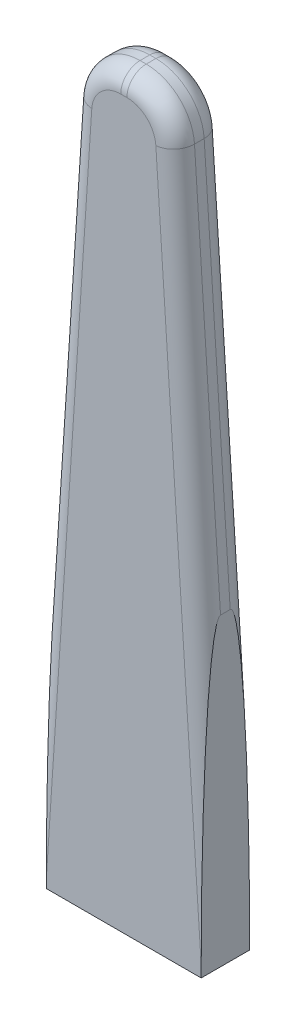
ISO-10303-21;
HEADER;
FILE_DESCRIPTION(('STEP AP214'),'2;1');
FILE_NAME('part.step','',(''),(''),'','','');
FILE_SCHEMA(('AUTOMOTIVE_DESIGN { 1 0 10303 214 1 1 1 1 }'));
ENDSEC;
DATA;
#1=APPLICATION_CONTEXT('core data for automotive mechanical design processes');
#2=APPLICATION_PROTOCOL_DEFINITION('international standard','automotive_design',2000,#1);
#3=PRODUCT_CONTEXT('',#1,'mechanical');
#4=PRODUCT('Part','Part','',(#3));
#5=PRODUCT_RELATED_PRODUCT_CATEGORY('part','',(#4));
#6=PRODUCT_DEFINITION_FORMATION('','',#4);
#7=PRODUCT_DEFINITION_CONTEXT('part definition',#1,'design');
#8=PRODUCT_DEFINITION('design','',#6,#7);
#9=PRODUCT_DEFINITION_SHAPE('','',#8);
#10=(LENGTH_UNIT() NAMED_UNIT(*) SI_UNIT(.MILLI.,.METRE.));
#11=(NAMED_UNIT(*) PLANE_ANGLE_UNIT() SI_UNIT($,.RADIAN.));
#12=(NAMED_UNIT(*) SI_UNIT($,.STERADIAN.) SOLID_ANGLE_UNIT());
#13=UNCERTAINTY_MEASURE_WITH_UNIT(LENGTH_MEASURE(1.E-05),#10,'distance_accuracy_value','');
#14=(GEOMETRIC_REPRESENTATION_CONTEXT(3) GLOBAL_UNCERTAINTY_ASSIGNED_CONTEXT((#13)) GLOBAL_UNIT_ASSIGNED_CONTEXT((#10,
#11,#12)) REPRESENTATION_CONTEXT('',''));
#15=CARTESIAN_POINT('',(0.,0.,0.));
#16=DIRECTION('',(0.,0.,1.));
#17=DIRECTION('',(1.,0.,0.));
#18=AXIS2_PLACEMENT_3D('',#15,#16,#17);
#19=CARTESIAN_POINT('',(0.,0.,0.));
#20=DIRECTION('',(0.,0.,-1.));
#21=DIRECTION('',(-1.,0.,0.));
#22=AXIS2_PLACEMENT_3D('',#19,#20,#21);
#23=PLANE('',#22);
#24=DIRECTION('',(0.,1.,0.));
#25=VECTOR('',#24,1.);
#26=CARTESIAN_POINT('',(1.3,0.,0.));
#27=LINE('',#26,#25);
#28=CARTESIAN_POINT('',(1.3,-3.0399195895799,0.));
#29=VERTEX_POINT('',#28);
#30=CARTESIAN_POINT('',(1.3,-3.15,0.));
#31=VERTEX_POINT('',#30);
#32=EDGE_CURVE('E102',#29,#31,#27,.F.);
#33=ORIENTED_EDGE('',*,*,#32,.T.);
#34=DIRECTION('',(-1.,0.,0.));
#35=VECTOR('',#34,1.);
#36=CARTESIAN_POINT('',(0.,-3.15,0.));
#37=LINE('',#36,#35);
#38=CARTESIAN_POINT('',(-0.3,-3.15,0.));
#39=VERTEX_POINT('',#38);
#40=EDGE_CURVE('E105',#31,#39,#37,.T.);
#41=ORIENTED_EDGE('',*,*,#40,.T.);
#42=DIRECTION('',(0.,1.,0.));
#43=VECTOR('',#42,1.);
#44=CARTESIAN_POINT('',(-0.3,0.,0.));
#45=LINE('',#44,#43);
#46=CARTESIAN_POINT('',(-0.300000000000003,-3.03991958957991,0.));
#47=VERTEX_POINT('',#46);
#48=EDGE_CURVE('E72',#39,#47,#45,.T.);
#49=ORIENTED_EDGE('',*,*,#48,.T.);
#50=DIRECTION('',(0.0657912139141957,0.99783341103197,0.));
#51=VECTOR('',#50,1.);
#52=CARTESIAN_POINT('',(0.199566682206393,4.53684175721716,0.));
#53=LINE('',#52,#51);
#54=CARTESIAN_POINT('',(0.168768590357411,4.06973736417426,0.));
#55=VERTEX_POINT('',#54);
#56=EDGE_CURVE('E109',#55,#47,#53,.F.);
#57=ORIENTED_EDGE('',*,*,#56,.F.);
#58=CARTESIAN_POINT('',(0.468118613667002,4.05,0.));
#59=DIRECTION('',(0.,0.,1.));
#60=DIRECTION('',(0.,1.,0.));
#61=AXIS2_PLACEMENT_3D('',#58,#59,#60);
#62=CIRCLE('',#61,0.3);
#63=CARTESIAN_POINT('',(0.468118613667002,4.35,0.));
#64=VERTEX_POINT('',#63);
#65=EDGE_CURVE('E166',#64,#55,#62,.T.);
#66=ORIENTED_EDGE('',*,*,#65,.F.);
#67=DIRECTION('',(-1.,0.,0.));
#68=VECTOR('',#67,1.);
#69=CARTESIAN_POINT('',(0.,4.35,0.));
#70=LINE('',#69,#68);
#71=CARTESIAN_POINT('',(0.531881386332997,4.35,0.));
#72=VERTEX_POINT('',#71);
#73=EDGE_CURVE('E157',#72,#64,#70,.T.);
#74=ORIENTED_EDGE('',*,*,#73,.F.);
#75=CARTESIAN_POINT('',(0.531881386332997,4.05,0.));
#76=DIRECTION('',(0.,0.,1.));
#77=DIRECTION('',(0.99783341103197,0.0657912139141968,0.));
#78=AXIS2_PLACEMENT_3D('',#75,#76,#77);
#79=CIRCLE('',#78,0.3);
#80=CARTESIAN_POINT('',(0.831231409642588,4.06973736417426,0.));
#81=VERTEX_POINT('',#80);
#82=EDGE_CURVE('E164',#81,#72,#79,.T.);
#83=ORIENTED_EDGE('',*,*,#82,.F.);
#84=DIRECTION('',(0.0657912139141959,-0.99783341103197,0.));
#85=VECTOR('',#84,1.);
#86=CARTESIAN_POINT('',(0.800433317793605,4.53684175721716,0.));
#87=LINE('',#86,#85);
#88=EDGE_CURVE('E83',#29,#81,#87,.F.);
#89=ORIENTED_EDGE('',*,*,#88,.F.);
#90=EDGE_LOOP('',(#33,#41,#49,#57,#66,#74,#83,#89));
#91=FACE_BOUND('',#90,.T.);
#92=ADVANCED_FACE('F16',(#91),#23,.T.);
#93=CARTESIAN_POINT('',(0.199566682206393,4.53684175721716,0.2));
#94=DIRECTION('',(0.0657912139141957,0.99783341103197,0.));
#95=DIRECTION('',(-0.99783341103197,0.0657912139141957,0.));
#96=AXIS2_PLACEMENT_3D('',#93,#94,#95);
#97=CYLINDRICAL_SURFACE('',#96,0.2);
#98=CARTESIAN_POINT('',(-0.3,-3.03991958957981,0.2));
#99=DIRECTION('',(1.,0.,0.));
#100=DIRECTION('',(0.,1.,0.));
#101=AXIS2_PLACEMENT_3D('',#98,#99,#100);
#102=ELLIPSE('',#101,3.03991958957981,0.2);
#103=CARTESIAN_POINT('',(-0.3,0.,0.2));
#104=VERTEX_POINT('',#103);
#105=EDGE_CURVE('E125',#47,#104,#102,.T.);
#106=ORIENTED_EDGE('',*,*,#105,.T.);
#107=DIRECTION('',(0.0657912139141958,0.99783341103197,0.));
#108=VECTOR('',#107,1.);
#109=CARTESIAN_POINT('',(0.,4.55,0.2));
#110=LINE('',#109,#108);
#111=CARTESIAN_POINT('',(-0.0307980918489834,4.0828956069571,0.2));
#112=VERTEX_POINT('',#111);
#113=EDGE_CURVE('E178',#104,#112,#110,.T.);
#114=ORIENTED_EDGE('',*,*,#113,.T.);
#115=CARTESIAN_POINT('',(0.168768590357411,4.06973736417426,0.2));
#116=DIRECTION('',(0.0657912139141968,0.99783341103197,0.));
#117=DIRECTION('',(-0.99783341103197,0.0657912139141968,0.));
#118=AXIS2_PLACEMENT_3D('',#115,#116,#117);
#119=CIRCLE('',#118,0.2);
#120=EDGE_CURVE('E159',#55,#112,#119,.T.);
#121=ORIENTED_EDGE('',*,*,#120,.F.);
#122=ORIENTED_EDGE('',*,*,#56,.T.);
#123=EDGE_LOOP('',(#106,#114,#121,#122));
#124=FACE_BOUND('',#123,.T.);
#125=ADVANCED_FACE('F531',(#124),#97,.T.);
#126=CARTESIAN_POINT('',(0.468118613667002,4.05,0.2));
#127=DIRECTION('',(0.,0.,-1.));
#128=DIRECTION('',(-1.,0.,0.));
#129=AXIS2_PLACEMENT_3D('',#126,#127,#128);
#130=TOROIDAL_SURFACE('',#129,0.3,0.2);
#131=ORIENTED_EDGE('',*,*,#120,.T.);
#132=CARTESIAN_POINT('',(0.468118613667002,4.05,0.2));
#133=DIRECTION('',(0.,0.,-1.));
#134=DIRECTION('',(-1.,0.,0.));
#135=AXIS2_PLACEMENT_3D('',#132,#133,#134);
#136=CIRCLE('',#135,0.5);
#137=CARTESIAN_POINT('',(0.468118613667002,4.55,0.2));
#138=VERTEX_POINT('',#137);
#139=EDGE_CURVE('E243',#138,#112,#136,.F.);
#140=ORIENTED_EDGE('',*,*,#139,.F.);
#141=CARTESIAN_POINT('',(0.468118613667002,4.35,0.2));
#142=DIRECTION('',(1.,0.,0.));
#143=DIRECTION('',(0.,0.,-1.));
#144=AXIS2_PLACEMENT_3D('',#141,#142,#143);
#145=CIRCLE('',#144,0.2);
#146=EDGE_CURVE('E158',#64,#138,#145,.T.);
#147=ORIENTED_EDGE('',*,*,#146,.F.);
#148=ORIENTED_EDGE('',*,*,#65,.T.);
#149=EDGE_LOOP('',(#131,#140,#147,#148));
#150=FACE_BOUND('',#149,.T.);
#151=ADVANCED_FACE('F525',(#150),#130,.T.);
#152=CARTESIAN_POINT('',(0.,4.35,0.2));
#153=DIRECTION('',(1.,0.,0.));
#154=DIRECTION('',(0.,0.,-1.));
#155=AXIS2_PLACEMENT_3D('',#152,#153,#154);
#156=CYLINDRICAL_SURFACE('',#155,0.2);
#157=ORIENTED_EDGE('',*,*,#146,.T.);
#158=DIRECTION('',(1.,0.,0.));
#159=VECTOR('',#158,1.);
#160=CARTESIAN_POINT('',(0.,4.55,0.2));
#161=LINE('',#160,#159);
#162=CARTESIAN_POINT('',(0.531881386332997,4.55,0.2));
#163=VERTEX_POINT('',#162);
#164=EDGE_CURVE('E239',#138,#163,#161,.T.);
#165=ORIENTED_EDGE('',*,*,#164,.T.);
#166=CARTESIAN_POINT('',(0.531881386332997,4.35,0.2));
#167=DIRECTION('',(1.,0.,0.));
#168=DIRECTION('',(0.,1.,0.));
#169=AXIS2_PLACEMENT_3D('',#166,#167,#168);
#170=CIRCLE('',#169,0.2);
#171=EDGE_CURVE('E235',#72,#163,#170,.T.);
#172=ORIENTED_EDGE('',*,*,#171,.F.);
#173=ORIENTED_EDGE('',*,*,#73,.T.);
#174=EDGE_LOOP('',(#157,#165,#172,#173));
#175=FACE_BOUND('',#174,.T.);
#176=ADVANCED_FACE('F228',(#175),#156,.T.);
#177=CARTESIAN_POINT('',(0.531881386332997,4.05,0.2));
#178=DIRECTION('',(0.,0.,-1.));
#179=DIRECTION('',(-1.,0.,0.));
#180=AXIS2_PLACEMENT_3D('',#177,#178,#179);
#181=TOROIDAL_SURFACE('',#180,0.3,0.2);
#182=ORIENTED_EDGE('',*,*,#171,.T.);
#183=CARTESIAN_POINT('',(0.531881386332997,4.05,0.2));
#184=DIRECTION('',(0.,0.,-1.));
#185=DIRECTION('',(-1.,0.,0.));
#186=AXIS2_PLACEMENT_3D('',#183,#184,#185);
#187=CIRCLE('',#186,0.5);
#188=CARTESIAN_POINT('',(1.03079809184898,4.0828956069571,0.2));
#189=VERTEX_POINT('',#188);
#190=EDGE_CURVE('E154',#189,#163,#187,.F.);
#191=ORIENTED_EDGE('',*,*,#190,.F.);
#192=CARTESIAN_POINT('',(0.831231409642588,4.06973736417426,0.2));
#193=DIRECTION('',(0.0657912139141959,-0.99783341103197,0.));
#194=DIRECTION('',(0.99783341103197,0.0657912139141959,0.));
#195=AXIS2_PLACEMENT_3D('',#192,#193,#194);
#196=CIRCLE('',#195,0.2);
#197=EDGE_CURVE('E156',#81,#189,#196,.T.);
#198=ORIENTED_EDGE('',*,*,#197,.F.);
#199=ORIENTED_EDGE('',*,*,#82,.T.);
#200=EDGE_LOOP('',(#182,#191,#198,#199));
#201=FACE_BOUND('',#200,.T.);
#202=ADVANCED_FACE('F216',(#201),#181,.T.);
#203=CARTESIAN_POINT('',(0.800433317793605,4.53684175721716,0.2));
#204=DIRECTION('',(0.0657912139141959,-0.99783341103197,0.));
#205=DIRECTION('',(0.99783341103197,0.0657912139141959,0.));
#206=AXIS2_PLACEMENT_3D('',#203,#204,#205);
#207=CYLINDRICAL_SURFACE('',#206,0.2);
#208=ORIENTED_EDGE('',*,*,#197,.T.);
#209=DIRECTION('',(0.0657912139141959,-0.99783341103197,0.));
#210=VECTOR('',#209,1.);
#211=CARTESIAN_POINT('',(0.999999999999999,4.55,0.2));
#212=LINE('',#211,#210);
#213=CARTESIAN_POINT('',(1.3,0.,0.2));
#214=VERTEX_POINT('',#213);
#215=EDGE_CURVE('E274',#189,#214,#212,.T.);
#216=ORIENTED_EDGE('',*,*,#215,.T.);
#217=CARTESIAN_POINT('',(1.3,-3.03991958957982,0.2));
#218=DIRECTION('',(-1.,0.,0.));
#219=DIRECTION('',(0.,-1.,0.));
#220=AXIS2_PLACEMENT_3D('',#217,#218,#219);
#221=ELLIPSE('',#220,3.03991958957982,0.2);
#222=EDGE_CURVE('E152',#214,#29,#221,.T.);
#223=ORIENTED_EDGE('',*,*,#222,.T.);
#224=ORIENTED_EDGE('',*,*,#88,.T.);
#225=EDGE_LOOP('',(#208,#216,#223,#224));
#226=FACE_BOUND('',#225,.T.);
#227=ADVANCED_FACE('F227',(#226),#207,.T.);
#228=CARTESIAN_POINT('',(-0.3,0.,0.5));
#229=DIRECTION('',(1.,0.,0.));
#230=DIRECTION('',(0.,1.,0.));
#231=AXIS2_PLACEMENT_3D('',#228,#229,#230);
#232=PLANE('',#231);
#233=CARTESIAN_POINT('',(-0.3,-3.03991958957981,0.3));
#234=DIRECTION('',(1.,0.,0.));
#235=DIRECTION('',(0.,-1.,0.));
#236=AXIS2_PLACEMENT_3D('',#233,#234,#235);
#237=ELLIPSE('',#236,3.03991958957981,0.2);
#238=CARTESIAN_POINT('',(-0.300000000000001,0.,0.3));
#239=VERTEX_POINT('',#238);
#240=CARTESIAN_POINT('',(-0.3,-3.0399195895798,0.5));
#241=VERTEX_POINT('',#240);
#242=EDGE_CURVE('E148',#239,#241,#237,.T.);
#243=ORIENTED_EDGE('',*,*,#242,.F.);
#244=DIRECTION('',(0.,0.,1.));
#245=VECTOR('',#244,1.);
#246=CARTESIAN_POINT('',(-0.300000000000001,0.,0.5));
#247=LINE('',#246,#245);
#248=EDGE_CURVE('E180',#239,#104,#247,.F.);
#249=ORIENTED_EDGE('',*,*,#248,.T.);
#250=ORIENTED_EDGE('',*,*,#105,.F.);
#251=ORIENTED_EDGE('',*,*,#48,.F.);
#252=DIRECTION('',(0.,0.,1.));
#253=VECTOR('',#252,1.);
#254=CARTESIAN_POINT('',(-0.3,-3.15,0.5));
#255=LINE('',#254,#253);
#256=CARTESIAN_POINT('',(-0.3,-3.15,0.5));
#257=VERTEX_POINT('',#256);
#258=EDGE_CURVE('E113',#39,#257,#255,.T.);
#259=ORIENTED_EDGE('',*,*,#258,.T.);
#260=DIRECTION('',(0.,1.,0.));
#261=VECTOR('',#260,1.);
#262=CARTESIAN_POINT('',(-0.3,0.,0.5));
#263=LINE('',#262,#261);
#264=EDGE_CURVE('E155',#241,#257,#263,.F.);
#265=ORIENTED_EDGE('',*,*,#264,.F.);
#266=EDGE_LOOP('',(#243,#249,#250,#251,#259,#265));
#267=FACE_BOUND('',#266,.T.);
#268=ADVANCED_FACE('F122',(#267),#232,.F.);
#269=CARTESIAN_POINT('',(0.,4.55,0.5));
#270=DIRECTION('',(0.99783341103197,-0.0657912139141958,0.));
#271=DIRECTION('',(0.0657912139141958,0.99783341103197,0.));
#272=AXIS2_PLACEMENT_3D('',#269,#270,#271);
#273=PLANE('',#272);
#274=DIRECTION('',(-0.0657912139141957,-0.99783341103197,0.));
#275=VECTOR('',#274,1.);
#276=CARTESIAN_POINT('',(-0.29870145485151,0.0196946014187808,0.3));
#277=LINE('',#276,#275);
#278=CARTESIAN_POINT('',(-0.0307980918489834,4.0828956069571,0.3));
#279=VERTEX_POINT('',#278);
#280=EDGE_CURVE('E151',#279,#239,#277,.T.);
#281=ORIENTED_EDGE('',*,*,#280,.F.);
#282=DIRECTION('',(0.,0.,-1.));
#283=VECTOR('',#282,1.);
#284=CARTESIAN_POINT('',(-0.0307980918489834,4.0828956069571,0.5));
#285=LINE('',#284,#283);
#286=EDGE_CURVE('E248',#112,#279,#285,.F.);
#287=ORIENTED_EDGE('',*,*,#286,.F.);
#288=ORIENTED_EDGE('',*,*,#113,.F.);
#289=ORIENTED_EDGE('',*,*,#248,.F.);
#290=EDGE_LOOP('',(#281,#287,#288,#289));
#291=FACE_BOUND('',#290,.T.);
#292=ADVANCED_FACE('F497',(#291),#273,.F.);
#293=CARTESIAN_POINT('',(0.468118613667002,4.05,0.5));
#294=DIRECTION('',(0.,0.,-1.));
#295=DIRECTION('',(-1.,0.,0.));
#296=AXIS2_PLACEMENT_3D('',#293,#294,#295);
#297=CYLINDRICAL_SURFACE('',#296,0.5);
#298=DIRECTION('',(0.,0.,-1.));
#299=VECTOR('',#298,1.);
#300=CARTESIAN_POINT('',(0.468118613667002,4.55,0.5));
#301=LINE('',#300,#299);
#302=CARTESIAN_POINT('',(0.468118613667002,4.55,0.3));
#303=VERTEX_POINT('',#302);
#304=EDGE_CURVE('E242',#303,#138,#301,.T.);
#305=ORIENTED_EDGE('',*,*,#304,.T.);
#306=ORIENTED_EDGE('',*,*,#139,.T.);
#307=ORIENTED_EDGE('',*,*,#286,.T.);
#308=CARTESIAN_POINT('',(0.468118613667002,4.05,0.3));
#309=DIRECTION('',(0.,0.,-1.));
#310=DIRECTION('',(-1.,0.,0.));
#311=AXIS2_PLACEMENT_3D('',#308,#309,#310);
#312=CIRCLE('',#311,0.5);
#313=EDGE_CURVE('E334',#303,#279,#312,.F.);
#314=ORIENTED_EDGE('',*,*,#313,.F.);
#315=EDGE_LOOP('',(#305,#306,#307,#314));
#316=FACE_BOUND('',#315,.T.);
#317=ADVANCED_FACE('F489',(#316),#297,.T.);
#318=CARTESIAN_POINT('',(0.,4.55,0.5));
#319=DIRECTION('',(0.,-1.,0.));
#320=DIRECTION('',(0.,0.,-1.));
#321=AXIS2_PLACEMENT_3D('',#318,#319,#320);
#322=PLANE('',#321);
#323=DIRECTION('',(-1.,0.,0.));
#324=VECTOR('',#323,1.);
#325=CARTESIAN_POINT('',(0.,4.55,0.3));
#326=LINE('',#325,#324);
#327=CARTESIAN_POINT('',(0.531881386332997,4.55,0.3));
#328=VERTEX_POINT('',#327);
#329=EDGE_CURVE('E328',#328,#303,#326,.T.);
#330=ORIENTED_EDGE('',*,*,#329,.F.);
#331=DIRECTION('',(0.,0.,-1.));
#332=VECTOR('',#331,1.);
#333=CARTESIAN_POINT('',(0.531881386332997,4.55,0.5));
#334=LINE('',#333,#332);
#335=EDGE_CURVE('E271',#163,#328,#334,.F.);
#336=ORIENTED_EDGE('',*,*,#335,.F.);
#337=ORIENTED_EDGE('',*,*,#164,.F.);
#338=ORIENTED_EDGE('',*,*,#304,.F.);
#339=EDGE_LOOP('',(#330,#336,#337,#338));
#340=FACE_BOUND('',#339,.T.);
#341=ADVANCED_FACE('F481',(#340),#322,.F.);
#342=CARTESIAN_POINT('',(0.531881386332997,4.05,0.5));
#343=DIRECTION('',(0.,0.,-1.));
#344=DIRECTION('',(-1.,0.,0.));
#345=AXIS2_PLACEMENT_3D('',#342,#343,#344);
#346=CYLINDRICAL_SURFACE('',#345,0.5);
#347=DIRECTION('',(0.,0.,1.));
#348=VECTOR('',#347,1.);
#349=CARTESIAN_POINT('',(1.03079809184898,4.0828956069571,0.5));
#350=LINE('',#349,#348);
#351=CARTESIAN_POINT('',(1.03079809184898,4.0828956069571,0.3));
#352=VERTEX_POINT('',#351);
#353=EDGE_CURVE('E118',#352,#189,#350,.F.);
#354=ORIENTED_EDGE('',*,*,#353,.T.);
#355=ORIENTED_EDGE('',*,*,#190,.T.);
#356=ORIENTED_EDGE('',*,*,#335,.T.);
#357=CARTESIAN_POINT('',(0.531881386332997,4.05,0.3));
#358=DIRECTION('',(0.,0.,-1.));
#359=DIRECTION('',(-1.,0.,0.));
#360=AXIS2_PLACEMENT_3D('',#357,#358,#359);
#361=CIRCLE('',#360,0.5);
#362=EDGE_CURVE('E147',#352,#328,#361,.F.);
#363=ORIENTED_EDGE('',*,*,#362,.F.);
#364=EDGE_LOOP('',(#354,#355,#356,#363));
#365=FACE_BOUND('',#364,.T.);
#366=ADVANCED_FACE('F473',(#365),#346,.T.);
#367=CARTESIAN_POINT('',(1.3,0.,0.5));
#368=DIRECTION('',(-1.,0.,0.));
#369=DIRECTION('',(0.,-1.,0.));
#370=AXIS2_PLACEMENT_3D('',#367,#368,#369);
#371=PLANE('',#370);
#372=CARTESIAN_POINT('',(1.3,-3.03991958957981,0.3));
#373=DIRECTION('',(-1.,0.,0.));
#374=DIRECTION('',(0.,1.,0.));
#375=AXIS2_PLACEMENT_3D('',#372,#373,#374);
#376=ELLIPSE('',#375,3.03991958957982,0.2);
#377=CARTESIAN_POINT('',(1.3,-3.0399195895798,0.5));
#378=VERTEX_POINT('',#377);
#379=CARTESIAN_POINT('',(1.3,0.,0.3));
#380=VERTEX_POINT('',#379);
#381=EDGE_CURVE('E144',#378,#380,#376,.T.);
#382=ORIENTED_EDGE('',*,*,#381,.F.);
#383=DIRECTION('',(0.,-1.,0.));
#384=VECTOR('',#383,1.);
#385=CARTESIAN_POINT('',(1.3,0.,0.5));
#386=LINE('',#385,#384);
#387=CARTESIAN_POINT('',(1.3,-3.15,0.5));
#388=VERTEX_POINT('',#387);
#389=EDGE_CURVE('E35',#388,#378,#386,.F.);
#390=ORIENTED_EDGE('',*,*,#389,.F.);
#391=DIRECTION('',(0.,0.,1.));
#392=VECTOR('',#391,1.);
#393=CARTESIAN_POINT('',(1.3,-3.15,0.5));
#394=LINE('',#393,#392);
#395=EDGE_CURVE('E117',#388,#31,#394,.F.);
#396=ORIENTED_EDGE('',*,*,#395,.T.);
#397=ORIENTED_EDGE('',*,*,#32,.F.);
#398=ORIENTED_EDGE('',*,*,#222,.F.);
#399=DIRECTION('',(0.,0.,1.));
#400=VECTOR('',#399,1.);
#401=CARTESIAN_POINT('',(1.3,0.,0.5));
#402=LINE('',#401,#400);
#403=EDGE_CURVE('E277',#214,#380,#402,.T.);
#404=ORIENTED_EDGE('',*,*,#403,.T.);
#405=EDGE_LOOP('',(#382,#390,#396,#397,#398,#404));
#406=FACE_BOUND('',#405,.T.);
#407=ADVANCED_FACE('F465',(#406),#371,.F.);
#408=CARTESIAN_POINT('',(0.999999999999999,4.55,0.5));
#409=DIRECTION('',(-0.99783341103197,-0.0657912139141959,0.));
#410=DIRECTION('',(0.0657912139141959,-0.99783341103197,0.));
#411=AXIS2_PLACEMENT_3D('',#408,#409,#410);
#412=PLANE('',#411);
#413=DIRECTION('',(-0.0657912139141959,0.99783341103197,0.));
#414=VECTOR('',#413,1.);
#415=CARTESIAN_POINT('',(1.29437297102321,0.0853432728147169,0.3));
#416=LINE('',#415,#414);
#417=EDGE_CURVE('E146',#380,#352,#416,.T.);
#418=ORIENTED_EDGE('',*,*,#417,.F.);
#419=ORIENTED_EDGE('',*,*,#403,.F.);
#420=ORIENTED_EDGE('',*,*,#215,.F.);
#421=ORIENTED_EDGE('',*,*,#353,.F.);
#422=EDGE_LOOP('',(#418,#419,#420,#421));
#423=FACE_BOUND('',#422,.T.);
#424=ADVANCED_FACE('F459',(#423),#412,.F.);
#425=CARTESIAN_POINT('',(1.3,-3.15,0.5));
#426=DIRECTION('',(0.,1.,0.));
#427=DIRECTION('',(0.,0.,1.));
#428=AXIS2_PLACEMENT_3D('',#425,#426,#427);
#429=PLANE('',#428);
#430=ORIENTED_EDGE('',*,*,#395,.F.);
#431=DIRECTION('',(-1.,0.,0.));
#432=VECTOR('',#431,1.);
#433=CARTESIAN_POINT('',(0.,-3.15,0.5));
#434=LINE('',#433,#432);
#435=EDGE_CURVE('E115',#388,#257,#434,.T.);
#436=ORIENTED_EDGE('',*,*,#435,.T.);
#437=ORIENTED_EDGE('',*,*,#258,.F.);
#438=ORIENTED_EDGE('',*,*,#40,.F.);
#439=EDGE_LOOP('',(#430,#436,#437,#438));
#440=FACE_BOUND('',#439,.T.);
#441=ADVANCED_FACE('F114',(#440),#429,.F.);
#442=CARTESIAN_POINT('',(-0.0991347726451155,0.00653635863594167,0.3));
#443=DIRECTION('',(-0.0657912139141957,-0.99783341103197,0.));
#444=DIRECTION('',(0.99783341103197,-0.0657912139141957,0.));
#445=AXIS2_PLACEMENT_3D('',#442,#443,#444);
#446=CYLINDRICAL_SURFACE('',#445,0.2);
#447=CARTESIAN_POINT('',(0.168768590357411,4.06973736417426,0.3));
#448=DIRECTION('',(0.0657912139141962,0.99783341103197,0.));
#449=DIRECTION('',(-0.99783341103197,0.0657912139141962,0.));
#450=AXIS2_PLACEMENT_3D('',#447,#448,#449);
#451=CIRCLE('',#450,0.2);
#452=CARTESIAN_POINT('',(0.168768590357411,4.06973736417426,0.5));
#453=VERTEX_POINT('',#452);
#454=EDGE_CURVE('E351',#279,#453,#451,.T.);
#455=ORIENTED_EDGE('',*,*,#454,.F.);
#456=ORIENTED_EDGE('',*,*,#280,.T.);
#457=ORIENTED_EDGE('',*,*,#242,.T.);
#458=DIRECTION('',(0.0657912139141957,0.99783341103197,0.));
#459=VECTOR('',#458,1.);
#460=CARTESIAN_POINT('',(-0.3,-3.03991958957981,0.5));
#461=LINE('',#460,#459);
#462=EDGE_CURVE('E288',#241,#453,#461,.T.);
#463=ORIENTED_EDGE('',*,*,#462,.T.);
#464=EDGE_LOOP('',(#455,#456,#457,#463));
#465=FACE_BOUND('',#464,.T.);
#466=ADVANCED_FACE('F345',(#465),#446,.T.);
#467=CARTESIAN_POINT('',(0.468118613667002,4.05,0.3));
#468=DIRECTION('',(0.,0.,-1.));
#469=DIRECTION('',(-1.,0.,0.));
#470=AXIS2_PLACEMENT_3D('',#467,#468,#469);
#471=TOROIDAL_SURFACE('',#470,0.3,0.2);
#472=CARTESIAN_POINT('',(0.468118613667002,4.35,0.3));
#473=DIRECTION('',(-1.,0.,0.));
#474=DIRECTION('',(0.,0.,1.));
#475=AXIS2_PLACEMENT_3D('',#472,#473,#474);
#476=CIRCLE('',#475,0.2);
#477=CARTESIAN_POINT('',(0.468118613667002,4.35,0.5));
#478=VERTEX_POINT('',#477);
#479=EDGE_CURVE('E331',#303,#478,#476,.F.);
#480=ORIENTED_EDGE('',*,*,#479,.F.);
#481=ORIENTED_EDGE('',*,*,#313,.T.);
#482=ORIENTED_EDGE('',*,*,#454,.T.);
#483=CARTESIAN_POINT('',(0.468118613667002,4.05,0.5));
#484=DIRECTION('',(0.,0.,-1.));
#485=DIRECTION('',(-0.99783341103197,0.0657912139141968,0.));
#486=AXIS2_PLACEMENT_3D('',#483,#484,#485);
#487=CIRCLE('',#486,0.3);
#488=EDGE_CURVE('E141',#453,#478,#487,.T.);
#489=ORIENTED_EDGE('',*,*,#488,.T.);
#490=EDGE_LOOP('',(#480,#481,#482,#489));
#491=FACE_BOUND('',#490,.T.);
#492=ADVANCED_FACE('F341',(#491),#471,.T.);
#493=CARTESIAN_POINT('',(0.,4.35,0.3));
#494=DIRECTION('',(-1.,0.,0.));
#495=DIRECTION('',(0.,0.,1.));
#496=AXIS2_PLACEMENT_3D('',#493,#494,#495);
#497=CYLINDRICAL_SURFACE('',#496,0.2);
#498=CARTESIAN_POINT('',(0.531881386332997,4.35,0.3));
#499=DIRECTION('',(1.,0.,0.));
#500=DIRECTION('',(0.,1.,0.));
#501=AXIS2_PLACEMENT_3D('',#498,#499,#500);
#502=CIRCLE('',#501,0.2);
#503=CARTESIAN_POINT('',(0.531881386332997,4.35,0.5));
#504=VERTEX_POINT('',#503);
#505=EDGE_CURVE('E320',#328,#504,#502,.T.);
#506=ORIENTED_EDGE('',*,*,#505,.F.);
#507=ORIENTED_EDGE('',*,*,#329,.T.);
#508=ORIENTED_EDGE('',*,*,#479,.T.);
#509=DIRECTION('',(-1.,0.,0.));
#510=VECTOR('',#509,1.);
#511=CARTESIAN_POINT('',(0.,4.35,0.5));
#512=LINE('',#511,#510);
#513=EDGE_CURVE('E138',#478,#504,#512,.F.);
#514=ORIENTED_EDGE('',*,*,#513,.T.);
#515=EDGE_LOOP('',(#506,#507,#508,#514));
#516=FACE_BOUND('',#515,.T.);
#517=ADVANCED_FACE('F313',(#516),#497,.T.);
#518=CARTESIAN_POINT('',(0.531881386332997,4.05,0.3));
#519=DIRECTION('',(0.,0.,-1.));
#520=DIRECTION('',(-1.,0.,0.));
#521=AXIS2_PLACEMENT_3D('',#518,#519,#520);
#522=TOROIDAL_SURFACE('',#521,0.3,0.2);
#523=CARTESIAN_POINT('',(0.831231409642588,4.06973736417426,0.3));
#524=DIRECTION('',(-0.0657912139141959,0.99783341103197,0.));
#525=DIRECTION('',(-0.99783341103197,-0.0657912139141959,0.));
#526=AXIS2_PLACEMENT_3D('',#523,#524,#525);
#527=CIRCLE('',#526,0.2);
#528=CARTESIAN_POINT('',(0.831231409642588,4.06973736417426,0.5));
#529=VERTEX_POINT('',#528);
#530=EDGE_CURVE('E289',#352,#529,#527,.F.);
#531=ORIENTED_EDGE('',*,*,#530,.F.);
#532=ORIENTED_EDGE('',*,*,#362,.T.);
#533=ORIENTED_EDGE('',*,*,#505,.T.);
#534=CARTESIAN_POINT('',(0.531881386332997,4.05,0.5));
#535=DIRECTION('',(0.,0.,-1.));
#536=DIRECTION('',(0.,1.,0.));
#537=AXIS2_PLACEMENT_3D('',#534,#535,#536);
#538=CIRCLE('',#537,0.3);
#539=EDGE_CURVE('E26',#504,#529,#538,.T.);
#540=ORIENTED_EDGE('',*,*,#539,.T.);
#541=EDGE_LOOP('',(#531,#532,#533,#540));
#542=FACE_BOUND('',#541,.T.);
#543=ADVANCED_FACE('F307',(#542),#522,.T.);
#544=CARTESIAN_POINT('',(1.09480628881681,0.0721850300318778,0.3));
#545=DIRECTION('',(-0.0657912139141959,0.99783341103197,0.));
#546=DIRECTION('',(-0.99783341103197,-0.0657912139141959,0.));
#547=AXIS2_PLACEMENT_3D('',#544,#545,#546);
#548=CYLINDRICAL_SURFACE('',#547,0.2);
#549=ORIENTED_EDGE('',*,*,#530,.T.);
#550=DIRECTION('',(0.0657912139141959,-0.99783341103197,0.));
#551=VECTOR('',#550,1.);
#552=CARTESIAN_POINT('',(0.831231409642588,4.06973736417426,0.5));
#553=LINE('',#552,#551);
#554=EDGE_CURVE('E10',#529,#378,#553,.T.);
#555=ORIENTED_EDGE('',*,*,#554,.T.);
#556=ORIENTED_EDGE('',*,*,#381,.T.);
#557=ORIENTED_EDGE('',*,*,#417,.T.);
#558=EDGE_LOOP('',(#549,#555,#556,#557));
#559=FACE_BOUND('',#558,.T.);
#560=ADVANCED_FACE('F312',(#559),#548,.T.);
#561=CARTESIAN_POINT('',(0.,0.,0.5));
#562=DIRECTION('',(0.,0.,-1.));
#563=DIRECTION('',(-1.,0.,0.));
#564=AXIS2_PLACEMENT_3D('',#561,#562,#563);
#565=PLANE('',#564);
#566=ORIENTED_EDGE('',*,*,#554,.F.);
#567=ORIENTED_EDGE('',*,*,#539,.F.);
#568=ORIENTED_EDGE('',*,*,#513,.F.);
#569=ORIENTED_EDGE('',*,*,#488,.F.);
#570=ORIENTED_EDGE('',*,*,#462,.F.);
#571=ORIENTED_EDGE('',*,*,#264,.T.);
#572=ORIENTED_EDGE('',*,*,#435,.F.);
#573=ORIENTED_EDGE('',*,*,#389,.T.);
#574=EDGE_LOOP('',(#566,#567,#568,#569,#570,#571,#572,#573));
#575=FACE_BOUND('',#574,.T.);
#576=ADVANCED_FACE('F398',(#575),#565,.F.);
#577=CLOSED_SHELL('',(#92,#125,#151,#176,#202,#227,#268,#292,#317,#341,#366,#407,#424,#441,#466,
#492,#517,#543,#560,#576));
#578=MANIFOLD_SOLID_BREP('B1',#577);
#579=ADVANCED_BREP_SHAPE_REPRESENTATION('',(#18,#578),#14);
#580=SHAPE_DEFINITION_REPRESENTATION(#9,#579);
ENDSEC;
END-ISO-10303-21;
